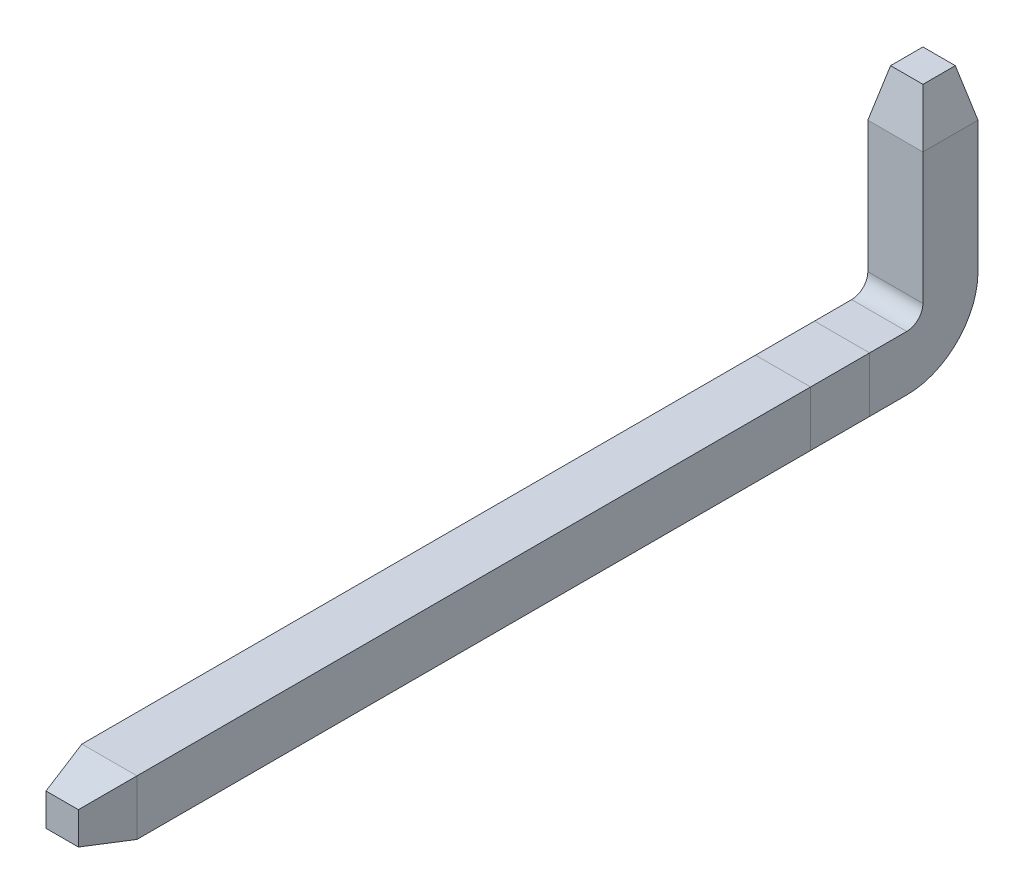
ISO-10303-21;
HEADER;
FILE_DESCRIPTION(('STEP AP214'),'2;1');
FILE_NAME('part.step','',(''),(''),'','','');
FILE_SCHEMA(('AUTOMOTIVE_DESIGN { 1 0 10303 214 1 1 1 1 }'));
ENDSEC;
DATA;
#1=APPLICATION_CONTEXT('core data for automotive mechanical design processes');
#2=APPLICATION_PROTOCOL_DEFINITION('international standard','automotive_design',2000,#1);
#3=PRODUCT_CONTEXT('',#1,'mechanical');
#4=PRODUCT('Part','Part','',(#3));
#5=PRODUCT_RELATED_PRODUCT_CATEGORY('part','',(#4));
#6=PRODUCT_DEFINITION_FORMATION('','',#4);
#7=PRODUCT_DEFINITION_CONTEXT('part definition',#1,'design');
#8=PRODUCT_DEFINITION('design','',#6,#7);
#9=PRODUCT_DEFINITION_SHAPE('','',#8);
#10=(LENGTH_UNIT() NAMED_UNIT(*) SI_UNIT(.MILLI.,.METRE.));
#11=(NAMED_UNIT(*) PLANE_ANGLE_UNIT() SI_UNIT($,.RADIAN.));
#12=(NAMED_UNIT(*) SI_UNIT($,.STERADIAN.) SOLID_ANGLE_UNIT());
#13=UNCERTAINTY_MEASURE_WITH_UNIT(LENGTH_MEASURE(1.E-05),#10,'distance_accuracy_value','');
#14=(GEOMETRIC_REPRESENTATION_CONTEXT(3) GLOBAL_UNCERTAINTY_ASSIGNED_CONTEXT((#13)) GLOBAL_UNIT_ASSIGNED_CONTEXT((#10,
#11,#12)) REPRESENTATION_CONTEXT('',''));
#15=CARTESIAN_POINT('',(0.,0.,0.));
#16=DIRECTION('',(0.,0.,1.));
#17=DIRECTION('',(1.,0.,0.));
#18=AXIS2_PLACEMENT_3D('',#15,#16,#17);
#19=CARTESIAN_POINT('',(8.598,-0.315,0.705));
#20=DIRECTION('',(0.,-1.,0.));
#21=DIRECTION('',(0.,0.,-1.));
#22=AXIS2_PLACEMENT_3D('',#19,#20,#21);
#23=PLANE('',#22);
#24=DIRECTION('',(0.,0.,-1.));
#25=VECTOR('',#24,1.);
#26=CARTESIAN_POINT('',(7.305,-0.315,0.705));
#27=LINE('',#26,#25);
#28=CARTESIAN_POINT('',(7.305,-0.315,1.915));
#29=VERTEX_POINT('',#28);
#30=CARTESIAN_POINT('',(7.305,-0.315,1.24005256704126));
#31=VERTEX_POINT('',#30);
#32=EDGE_CURVE('E11',#29,#31,#27,.T.);
#33=ORIENTED_EDGE('',*,*,#32,.T.);
#34=DIRECTION('',(1.,0.,0.));
#35=VECTOR('',#34,1.);
#36=CARTESIAN_POINT('',(8.598,-0.315,1.24005256704126));
#37=LINE('',#36,#35);
#38=CARTESIAN_POINT('',(7.935,-0.315,1.24005256704126));
#39=VERTEX_POINT('',#38);
#40=EDGE_CURVE('E25',#31,#39,#37,.T.);
#41=ORIENTED_EDGE('',*,*,#40,.T.);
#42=DIRECTION('',(0.,0.,1.));
#43=VECTOR('',#42,1.);
#44=CARTESIAN_POINT('',(7.935,-0.315,0.705));
#45=LINE('',#44,#43);
#46=CARTESIAN_POINT('',(7.935,-0.315,1.915));
#47=VERTEX_POINT('',#46);
#48=EDGE_CURVE('E374',#39,#47,#45,.T.);
#49=ORIENTED_EDGE('',*,*,#48,.T.);
#50=DIRECTION('',(1.,0.,0.));
#51=VECTOR('',#50,1.);
#52=CARTESIAN_POINT('',(8.598,-0.315,1.915));
#53=LINE('',#52,#51);
#54=EDGE_CURVE('E370',#29,#47,#53,.T.);
#55=ORIENTED_EDGE('',*,*,#54,.F.);
#56=EDGE_LOOP('',(#33,#41,#49,#55));
#57=FACE_BOUND('',#56,.T.);
#58=ADVANCED_FACE('F17',(#57),#23,.T.);
#59=CARTESIAN_POINT('',(8.598,0.315,2.025));
#60=DIRECTION('',(0.,1.,0.));
#61=DIRECTION('',(1.,0.,0.));
#62=AXIS2_PLACEMENT_3D('',#59,#60,#61);
#63=PLANE('',#62);
#64=DIRECTION('',(0.,0.,1.));
#65=VECTOR('',#64,1.);
#66=CARTESIAN_POINT('',(7.935,0.315,-0.1915));
#67=LINE('',#66,#65);
#68=CARTESIAN_POINT('',(7.935,0.315,1.24005256704126));
#69=VERTEX_POINT('',#68);
#70=CARTESIAN_POINT('',(7.935,0.315,1.915));
#71=VERTEX_POINT('',#70);
#72=EDGE_CURVE('E367',#69,#71,#67,.T.);
#73=ORIENTED_EDGE('',*,*,#72,.F.);
#74=DIRECTION('',(-1.,0.,0.));
#75=VECTOR('',#74,1.);
#76=CARTESIAN_POINT('',(8.598,0.315,1.24005256704126));
#77=LINE('',#76,#75);
#78=CARTESIAN_POINT('',(7.305,0.315,1.24005256704126));
#79=VERTEX_POINT('',#78);
#80=EDGE_CURVE('E365',#69,#79,#77,.T.);
#81=ORIENTED_EDGE('',*,*,#80,.T.);
#82=DIRECTION('',(0.,0.,-1.));
#83=VECTOR('',#82,1.);
#84=CARTESIAN_POINT('',(7.305,0.315,-0.1915));
#85=LINE('',#84,#83);
#86=CARTESIAN_POINT('',(7.305,0.315,1.915));
#87=VERTEX_POINT('',#86);
#88=EDGE_CURVE('E361',#87,#79,#85,.T.);
#89=ORIENTED_EDGE('',*,*,#88,.F.);
#90=DIRECTION('',(-1.,0.,0.));
#91=VECTOR('',#90,1.);
#92=CARTESIAN_POINT('',(8.598,0.315,1.915));
#93=LINE('',#92,#91);
#94=EDGE_CURVE('E357',#71,#87,#93,.T.);
#95=ORIENTED_EDGE('',*,*,#94,.F.);
#96=EDGE_LOOP('',(#73,#81,#89,#95));
#97=FACE_BOUND('',#96,.T.);
#98=ADVANCED_FACE('F422',(#97),#63,.T.);
#99=CARTESIAN_POINT('',(7.305,2.8255,-0.1915));
#100=DIRECTION('',(-1.,0.,0.));
#101=DIRECTION('',(0.,0.,1.));
#102=AXIS2_PLACEMENT_3D('',#99,#100,#101);
#103=PLANE('',#102);
#104=ORIENTED_EDGE('',*,*,#88,.T.);
#105=DIRECTION('',(0.,-1.,0.));
#106=VECTOR('',#105,1.);
#107=CARTESIAN_POINT('',(7.305,2.8255,1.24005256704126));
#108=LINE('',#107,#106);
#109=EDGE_CURVE('E355',#79,#31,#108,.T.);
#110=ORIENTED_EDGE('',*,*,#109,.T.);
#111=ORIENTED_EDGE('',*,*,#32,.F.);
#112=DIRECTION('',(0.,-1.,0.));
#113=VECTOR('',#112,1.);
#114=CARTESIAN_POINT('',(7.305,0.978,1.915));
#115=LINE('',#114,#113);
#116=EDGE_CURVE('E351',#87,#29,#115,.T.);
#117=ORIENTED_EDGE('',*,*,#116,.F.);
#118=EDGE_LOOP('',(#104,#110,#111,#117));
#119=FACE_BOUND('',#118,.T.);
#120=ADVANCED_FACE('F424',(#119),#103,.T.);
#121=CARTESIAN_POINT('',(7.935,2.8255,-0.1915));
#122=DIRECTION('',(1.,0.,0.));
#123=DIRECTION('',(0.,1.,0.));
#124=AXIS2_PLACEMENT_3D('',#121,#122,#123);
#125=PLANE('',#124);
#126=ORIENTED_EDGE('',*,*,#48,.F.);
#127=DIRECTION('',(0.,1.,0.));
#128=VECTOR('',#127,1.);
#129=CARTESIAN_POINT('',(7.935,2.8255,1.24005256704126));
#130=LINE('',#129,#128);
#131=EDGE_CURVE('E348',#39,#69,#130,.T.);
#132=ORIENTED_EDGE('',*,*,#131,.T.);
#133=ORIENTED_EDGE('',*,*,#72,.T.);
#134=DIRECTION('',(0.,1.,0.));
#135=VECTOR('',#134,1.);
#136=CARTESIAN_POINT('',(7.935,0.978,1.915));
#137=LINE('',#136,#135);
#138=EDGE_CURVE('E344',#47,#71,#137,.T.);
#139=ORIENTED_EDGE('',*,*,#138,.F.);
#140=EDGE_LOOP('',(#126,#132,#133,#139));
#141=FACE_BOUND('',#140,.T.);
#142=ADVANCED_FACE('F381',(#141),#125,.T.);
#143=CARTESIAN_POINT('',(8.598,2.54,1.293));
#144=DIRECTION('',(0.,1.,0.));
#145=DIRECTION('',(1.,0.,0.));
#146=AXIS2_PLACEMENT_3D('',#143,#144,#145);
#147=PLANE('',#146);
#148=DIRECTION('',(9.0573847817001E-05,0.,-0.999999995898189));
#149=VECTOR('',#148,1.);
#150=CARTESIAN_POINT('',(7.43487635788854,2.54,-0.000222915201498932));
#151=LINE('',#150,#149);
#152=CARTESIAN_POINT('',(7.4348495218709,2.54001212571568,0.499678242049048));
#153=VERTEX_POINT('',#152);
#154=CARTESIAN_POINT('',(7.43486461504236,2.54,0.12942649701042));
#155=VERTEX_POINT('',#154);
#156=EDGE_CURVE('E339',#153,#155,#151,.T.);
#157=ORIENTED_EDGE('',*,*,#156,.F.);
#158=DIRECTION('',(-1.,0.,0.));
#159=VECTOR('',#158,1.);
#160=CARTESIAN_POINT('',(7.30500000015227,2.54,0.499730833388735));
#161=LINE('',#160,#159);
#162=CARTESIAN_POINT('',(7.80515047843365,2.54001212571568,0.499678242049049));
#163=VERTEX_POINT('',#162);
#164=EDGE_CURVE('E333',#163,#153,#161,.T.);
#165=ORIENTED_EDGE('',*,*,#164,.F.);
#166=DIRECTION('',(9.05738478169111E-05,0.,0.999999995898189));
#167=VECTOR('',#166,1.);
#168=CARTESIAN_POINT('',(7.80518070393584,2.54,0.629777034937407));
#169=LINE('',#168,#167);
#170=CARTESIAN_POINT('',(7.80513538526218,2.54,0.12942649701042));
#171=VERTEX_POINT('',#170);
#172=EDGE_CURVE('E327',#171,#163,#169,.T.);
#173=ORIENTED_EDGE('',*,*,#172,.F.);
#174=DIRECTION('',(1.,0.,0.));
#175=VECTOR('',#174,1.);
#176=CARTESIAN_POINT('',(7.93500000015227,2.54,0.12942649701042));
#177=LINE('',#176,#175);
#178=EDGE_CURVE('E323',#155,#171,#177,.T.);
#179=ORIENTED_EDGE('',*,*,#178,.F.);
#180=EDGE_LOOP('',(#157,#165,#173,#179));
#181=FACE_BOUND('',#180,.T.);
#182=ADVANCED_FACE('F458',(#181),#147,.T.);
#183=CARTESIAN_POINT('',(7.30500000015227,2.00011653491076,0.629765276704178));
#184=DIRECTION('',(0.,0.234160215533744,0.972198021732811));
#185=DIRECTION('',(1.,0.,0.));
#186=AXIS2_PLACEMENT_3D('',#183,#184,#185);
#187=PLANE('',#186);
#188=DIRECTION('',(0.227655002210228,-0.946669905004514,0.228011602615756));
#189=VECTOR('',#188,1.);
#190=CARTESIAN_POINT('',(7.93500000015227,2.00011653491076,0.629765276704179));
#191=LINE('',#190,#189);
#192=CARTESIAN_POINT('',(7.93500000028708,2.00010401844251,0.629886441826773));
#193=VERTEX_POINT('',#192);
#194=EDGE_CURVE('E318',#163,#193,#191,.T.);
#195=ORIENTED_EDGE('',*,*,#194,.F.);
#196=ORIENTED_EDGE('',*,*,#164,.T.);
#197=DIRECTION('',(0.227655002210228,0.946669905004514,-0.228011602615756));
#198=VECTOR('',#197,1.);
#199=CARTESIAN_POINT('',(7.33765088417201,2.13589044267994,0.597063248108785));
#200=LINE('',#199,#198);
#201=CARTESIAN_POINT('',(7.304999999793,2.00010401843991,0.629886441828584));
#202=VERTEX_POINT('',#201);
#203=EDGE_CURVE('E312',#202,#153,#200,.T.);
#204=ORIENTED_EDGE('',*,*,#203,.F.);
#205=DIRECTION('',(-1.,0.,0.));
#206=VECTOR('',#205,1.);
#207=CARTESIAN_POINT('',(8.598,1.9991419990643,0.63));
#208=LINE('',#207,#206);
#209=EDGE_CURVE('E306',#193,#202,#208,.T.);
#210=ORIENTED_EDGE('',*,*,#209,.F.);
#211=EDGE_LOOP('',(#195,#196,#204,#210));
#212=FACE_BOUND('',#211,.T.);
#213=ADVANCED_FACE('F404',(#212),#187,.T.);
#214=CARTESIAN_POINT('',(7.30500000015227,1.99987923142851,-0.000234678603007815));
#215=DIRECTION('',(-0.972286154406282,0.233793982374715,-8.80636985449924E-05));
#216=DIRECTION('',(-9.05738478170011E-05,0.,0.999999995898189));
#217=AXIS2_PLACEMENT_3D('',#214,#215,#216);
#218=PLANE('',#217);
#219=ORIENTED_EDGE('',*,*,#203,.T.);
#220=ORIENTED_EDGE('',*,*,#156,.T.);
#221=DIRECTION('',(0.227655002210228,0.946841407622854,0.227298369504565));
#222=VECTOR('',#221,1.);
#223=CARTESIAN_POINT('',(7.33765088417201,2.13567773655794,0.0323650562085161));
#224=LINE('',#223,#222);
#225=CARTESIAN_POINT('',(7.30499999979406,1.99989171173503,-0.000113559496830448));
#226=VERTEX_POINT('',#225);
#227=EDGE_CURVE('E300',#226,#155,#224,.T.);
#228=ORIENTED_EDGE('',*,*,#227,.F.);
#229=DIRECTION('',(0.,-0.000376672180686717,-0.999999929059032));
#230=VECTOR('',#229,1.);
#231=CARTESIAN_POINT('',(7.305,2.00011653491076,0.629882638352091));
#232=LINE('',#231,#230);
#233=EDGE_CURVE('E294',#202,#226,#232,.T.);
#234=ORIENTED_EDGE('',*,*,#233,.F.);
#235=EDGE_LOOP('',(#219,#220,#228,#234));
#236=FACE_BOUND('',#235,.T.);
#237=ADVANCED_FACE('F410',(#236),#218,.T.);
#238=CARTESIAN_POINT('',(7.93500000015227,1.99987923142851,-0.000234678603007951));
#239=DIRECTION('',(0.,0.233427749215686,-0.972374149129901));
#240=DIRECTION('',(-1.,0.,0.));
#241=AXIS2_PLACEMENT_3D('',#238,#239,#240);
#242=PLANE('',#241);
#243=ORIENTED_EDGE('',*,*,#227,.T.);
#244=ORIENTED_EDGE('',*,*,#178,.T.);
#245=DIRECTION('',(-0.227655002210228,0.946841407622854,0.227298369504565));
#246=VECTOR('',#245,1.);
#247=CARTESIAN_POINT('',(7.90234911613253,2.13567773655793,0.0323650562085151));
#248=LINE('',#247,#246);
#249=CARTESIAN_POINT('',(7.93500000028601,1.99989171173759,-0.000113559495025209));
#250=VERTEX_POINT('',#249);
#251=EDGE_CURVE('E288',#250,#171,#248,.T.);
#252=ORIENTED_EDGE('',*,*,#251,.F.);
#253=DIRECTION('',(1.,0.,0.));
#254=VECTOR('',#253,1.);
#255=CARTESIAN_POINT('',(8.598,2.00085681617448,0.));
#256=LINE('',#255,#254);
#257=EDGE_CURVE('E282',#226,#250,#256,.T.);
#258=ORIENTED_EDGE('',*,*,#257,.F.);
#259=EDGE_LOOP('',(#243,#244,#252,#258));
#260=FACE_BOUND('',#259,.T.);
#261=ADVANCED_FACE('F466',(#260),#242,.T.);
#262=CARTESIAN_POINT('',(7.93500000015227,2.00011653491076,0.629765276704179));
#263=DIRECTION('',(0.972286154406282,0.233793982374715,-8.8063698544905E-05));
#264=DIRECTION('',(0.,-0.000376672194053463,-0.999999929059027));
#265=AXIS2_PLACEMENT_3D('',#262,#263,#264);
#266=PLANE('',#265);
#267=ORIENTED_EDGE('',*,*,#251,.T.);
#268=ORIENTED_EDGE('',*,*,#172,.T.);
#269=ORIENTED_EDGE('',*,*,#194,.T.);
#270=DIRECTION('',(0.,0.000376672180686717,0.999999929059032));
#271=VECTOR('',#270,1.);
#272=CARTESIAN_POINT('',(7.935,1.99987923142851,-0.00011733930150299));
#273=LINE('',#272,#271);
#274=EDGE_CURVE('E276',#250,#193,#273,.T.);
#275=ORIENTED_EDGE('',*,*,#274,.F.);
#276=EDGE_LOOP('',(#267,#268,#269,#275));
#277=FACE_BOUND('',#276,.T.);
#278=ADVANCED_FACE('F400',(#277),#266,.T.);
#279=CARTESIAN_POINT('',(8.598,0.296,0.63));
#280=DIRECTION('',(0.,0.,1.));
#281=DIRECTION('',(1.,0.,0.));
#282=AXIS2_PLACEMENT_3D('',#279,#280,#281);
#283=PLANE('',#282);
#284=DIRECTION('',(0.,-1.,0.));
#285=VECTOR('',#284,1.);
#286=CARTESIAN_POINT('',(7.935,2.8255,0.63));
#287=LINE('',#286,#285);
#288=CARTESIAN_POINT('',(7.935,0.5,0.63));
#289=VERTEX_POINT('',#288);
#290=EDGE_CURVE('E271',#193,#289,#287,.T.);
#291=ORIENTED_EDGE('',*,*,#290,.F.);
#292=ORIENTED_EDGE('',*,*,#209,.T.);
#293=DIRECTION('',(0.,1.,0.));
#294=VECTOR('',#293,1.);
#295=CARTESIAN_POINT('',(7.305,2.8255,0.63));
#296=LINE('',#295,#294);
#297=CARTESIAN_POINT('',(7.305,0.500000000000011,0.63));
#298=VERTEX_POINT('',#297);
#299=EDGE_CURVE('E265',#298,#202,#296,.T.);
#300=ORIENTED_EDGE('',*,*,#299,.F.);
#301=DIRECTION('',(-1.,0.,0.));
#302=VECTOR('',#301,1.);
#303=CARTESIAN_POINT('',(7.998,0.5,0.63));
#304=LINE('',#303,#302);
#305=EDGE_CURVE('E261',#289,#298,#304,.T.);
#306=ORIENTED_EDGE('',*,*,#305,.F.);
#307=EDGE_LOOP('',(#291,#292,#300,#306));
#308=FACE_BOUND('',#307,.T.);
#309=ADVANCED_FACE('F407',(#308),#283,.T.);
#310=CARTESIAN_POINT('',(7.998,0.5,0.815));
#311=DIRECTION('',(-1.,0.,0.));
#312=DIRECTION('',(0.,0.,1.));
#313=AXIS2_PLACEMENT_3D('',#310,#311,#312);
#314=CYLINDRICAL_SURFACE('',#313,0.185);
#315=ORIENTED_EDGE('',*,*,#305,.T.);
#316=CARTESIAN_POINT('',(7.305,0.500000000000012,0.815000000000011));
#317=DIRECTION('',(1.,0.,0.));
#318=DIRECTION('',(0.,0.,1.));
#319=AXIS2_PLACEMENT_3D('',#316,#317,#318);
#320=CIRCLE('',#319,0.185);
#321=CARTESIAN_POINT('',(7.305,0.315,0.815));
#322=VERTEX_POINT('',#321);
#323=EDGE_CURVE('E257',#322,#298,#320,.T.);
#324=ORIENTED_EDGE('',*,*,#323,.F.);
#325=DIRECTION('',(-1.,0.,0.));
#326=VECTOR('',#325,1.);
#327=CARTESIAN_POINT('',(8.598,0.315,0.815));
#328=LINE('',#327,#326);
#329=CARTESIAN_POINT('',(7.935,0.315,0.815));
#330=VERTEX_POINT('',#329);
#331=EDGE_CURVE('E253',#330,#322,#328,.T.);
#332=ORIENTED_EDGE('',*,*,#331,.F.);
#333=CARTESIAN_POINT('',(7.935,0.5,0.815));
#334=DIRECTION('',(-1.,0.,0.));
#335=DIRECTION('',(0.,0.,1.));
#336=AXIS2_PLACEMENT_3D('',#333,#334,#335);
#337=CIRCLE('',#336,0.185);
#338=EDGE_CURVE('E249',#289,#330,#337,.T.);
#339=ORIENTED_EDGE('',*,*,#338,.F.);
#340=EDGE_LOOP('',(#315,#324,#332,#339));
#341=FACE_BOUND('',#340,.T.);
#342=ADVANCED_FACE('F416',(#341),#314,.F.);
#343=CARTESIAN_POINT('',(8.598,0.315,2.025));
#344=DIRECTION('',(0.,1.,0.));
#345=DIRECTION('',(1.,0.,0.));
#346=AXIS2_PLACEMENT_3D('',#343,#344,#345);
#347=PLANE('',#346);
#348=ORIENTED_EDGE('',*,*,#80,.F.);
#349=DIRECTION('',(0.,0.,1.));
#350=VECTOR('',#349,1.);
#351=CARTESIAN_POINT('',(7.935,0.315,-0.1915));
#352=LINE('',#351,#350);
#353=EDGE_CURVE('E245',#330,#69,#352,.T.);
#354=ORIENTED_EDGE('',*,*,#353,.F.);
#355=ORIENTED_EDGE('',*,*,#331,.T.);
#356=DIRECTION('',(0.,0.,-1.));
#357=VECTOR('',#356,1.);
#358=CARTESIAN_POINT('',(7.305,0.315,-0.1915));
#359=LINE('',#358,#357);
#360=EDGE_CURVE('E241',#79,#322,#359,.T.);
#361=ORIENTED_EDGE('',*,*,#360,.F.);
#362=EDGE_LOOP('',(#348,#354,#355,#361));
#363=FACE_BOUND('',#362,.T.);
#364=ADVANCED_FACE('F420',(#363),#347,.T.);
#365=CARTESIAN_POINT('',(7.305,2.8255,-0.1915));
#366=DIRECTION('',(-1.,0.,0.));
#367=DIRECTION('',(0.,0.,1.));
#368=AXIS2_PLACEMENT_3D('',#365,#366,#367);
#369=PLANE('',#368);
#370=ORIENTED_EDGE('',*,*,#109,.F.);
#371=ORIENTED_EDGE('',*,*,#360,.T.);
#372=ORIENTED_EDGE('',*,*,#323,.T.);
#373=ORIENTED_EDGE('',*,*,#299,.T.);
#374=ORIENTED_EDGE('',*,*,#233,.T.);
#375=DIRECTION('',(0.,1.,0.));
#376=VECTOR('',#375,1.);
#377=CARTESIAN_POINT('',(7.305,2.744,0.));
#378=LINE('',#377,#376);
#379=CARTESIAN_POINT('',(7.305,0.5,0.));
#380=VERTEX_POINT('',#379);
#381=EDGE_CURVE('E235',#380,#226,#378,.T.);
#382=ORIENTED_EDGE('',*,*,#381,.F.);
#383=CARTESIAN_POINT('',(7.305,0.5,0.815));
#384=DIRECTION('',(1.,0.,0.));
#385=DIRECTION('',(0.,0.,1.));
#386=AXIS2_PLACEMENT_3D('',#383,#384,#385);
#387=CIRCLE('',#386,0.815);
#388=CARTESIAN_POINT('',(7.305,-0.315,0.815));
#389=VERTEX_POINT('',#388);
#390=EDGE_CURVE('E231',#389,#380,#387,.T.);
#391=ORIENTED_EDGE('',*,*,#390,.F.);
#392=DIRECTION('',(0.,0.,-1.));
#393=VECTOR('',#392,1.);
#394=CARTESIAN_POINT('',(7.305,-0.315,0.705));
#395=LINE('',#394,#393);
#396=EDGE_CURVE('E227',#31,#389,#395,.T.);
#397=ORIENTED_EDGE('',*,*,#396,.F.);
#398=EDGE_LOOP('',(#370,#371,#372,#373,#374,#382,#391,#397));
#399=FACE_BOUND('',#398,.T.);
#400=ADVANCED_FACE('F413',(#399),#369,.T.);
#401=CARTESIAN_POINT('',(8.598,2.744,0.));
#402=DIRECTION('',(0.,0.,-1.));
#403=DIRECTION('',(0.,-1.,0.));
#404=AXIS2_PLACEMENT_3D('',#401,#402,#403);
#405=PLANE('',#404);
#406=ORIENTED_EDGE('',*,*,#381,.T.);
#407=ORIENTED_EDGE('',*,*,#257,.T.);
#408=DIRECTION('',(0.,1.,0.));
#409=VECTOR('',#408,1.);
#410=CARTESIAN_POINT('',(7.935,2.8255,0.));
#411=LINE('',#410,#409);
#412=CARTESIAN_POINT('',(7.935,0.5,0.));
#413=VERTEX_POINT('',#412);
#414=EDGE_CURVE('E221',#413,#250,#411,.T.);
#415=ORIENTED_EDGE('',*,*,#414,.F.);
#416=DIRECTION('',(1.,0.,0.));
#417=VECTOR('',#416,1.);
#418=CARTESIAN_POINT('',(7.998,0.5,0.));
#419=LINE('',#418,#417);
#420=EDGE_CURVE('E217',#380,#413,#419,.T.);
#421=ORIENTED_EDGE('',*,*,#420,.F.);
#422=EDGE_LOOP('',(#406,#407,#415,#421));
#423=FACE_BOUND('',#422,.T.);
#424=ADVANCED_FACE('F396',(#423),#405,.T.);
#425=CARTESIAN_POINT('',(7.935,2.8255,-0.1915));
#426=DIRECTION('',(1.,0.,0.));
#427=DIRECTION('',(0.,1.,0.));
#428=AXIS2_PLACEMENT_3D('',#425,#426,#427);
#429=PLANE('',#428);
#430=ORIENTED_EDGE('',*,*,#131,.F.);
#431=DIRECTION('',(0.,0.,1.));
#432=VECTOR('',#431,1.);
#433=CARTESIAN_POINT('',(7.935,-0.315,0.705));
#434=LINE('',#433,#432);
#435=CARTESIAN_POINT('',(7.935,-0.315,0.815));
#436=VERTEX_POINT('',#435);
#437=EDGE_CURVE('E213',#436,#39,#434,.T.);
#438=ORIENTED_EDGE('',*,*,#437,.F.);
#439=CARTESIAN_POINT('',(7.935,0.5,0.815));
#440=DIRECTION('',(-1.,0.,0.));
#441=DIRECTION('',(0.,0.,1.));
#442=AXIS2_PLACEMENT_3D('',#439,#440,#441);
#443=CIRCLE('',#442,0.815);
#444=EDGE_CURVE('E209',#413,#436,#443,.T.);
#445=ORIENTED_EDGE('',*,*,#444,.F.);
#446=ORIENTED_EDGE('',*,*,#414,.T.);
#447=ORIENTED_EDGE('',*,*,#274,.T.);
#448=ORIENTED_EDGE('',*,*,#290,.T.);
#449=ORIENTED_EDGE('',*,*,#338,.T.);
#450=ORIENTED_EDGE('',*,*,#353,.T.);
#451=EDGE_LOOP('',(#430,#438,#445,#446,#447,#448,#449,#450));
#452=FACE_BOUND('',#451,.T.);
#453=ADVANCED_FACE('F384',(#452),#429,.T.);
#454=CARTESIAN_POINT('',(8.598,-0.315,0.705));
#455=DIRECTION('',(0.,-1.,0.));
#456=DIRECTION('',(0.,0.,-1.));
#457=AXIS2_PLACEMENT_3D('',#454,#455,#456);
#458=PLANE('',#457);
#459=ORIENTED_EDGE('',*,*,#40,.F.);
#460=ORIENTED_EDGE('',*,*,#396,.T.);
#461=DIRECTION('',(-1.,0.,0.));
#462=VECTOR('',#461,1.);
#463=CARTESIAN_POINT('',(7.998,-0.315,0.815));
#464=LINE('',#463,#462);
#465=EDGE_CURVE('E205',#436,#389,#464,.T.);
#466=ORIENTED_EDGE('',*,*,#465,.F.);
#467=ORIENTED_EDGE('',*,*,#437,.T.);
#468=EDGE_LOOP('',(#459,#460,#466,#467));
#469=FACE_BOUND('',#468,.T.);
#470=ADVANCED_FACE('F388',(#469),#458,.T.);
#471=CARTESIAN_POINT('',(7.998,0.5,0.815));
#472=DIRECTION('',(-1.,0.,0.));
#473=DIRECTION('',(0.,0.,1.));
#474=AXIS2_PLACEMENT_3D('',#471,#472,#473);
#475=CYLINDRICAL_SURFACE('',#474,0.815);
#476=ORIENTED_EDGE('',*,*,#444,.T.);
#477=ORIENTED_EDGE('',*,*,#465,.T.);
#478=ORIENTED_EDGE('',*,*,#390,.T.);
#479=ORIENTED_EDGE('',*,*,#420,.T.);
#480=EDGE_LOOP('',(#476,#477,#478,#479));
#481=FACE_BOUND('',#480,.T.);
#482=ADVANCED_FACE('F391',(#481),#475,.T.);
#483=CARTESIAN_POINT('',(7.935,0.978,1.085));
#484=DIRECTION('',(1.,0.,0.));
#485=DIRECTION('',(0.,1.,0.));
#486=AXIS2_PLACEMENT_3D('',#483,#484,#485);
#487=PLANE('',#486);
#488=ORIENTED_EDGE('',*,*,#138,.T.);
#489=DIRECTION('',(0.,0.,-1.));
#490=VECTOR('',#489,1.);
#491=CARTESIAN_POINT('',(7.935,0.315,11.045));
#492=LINE('',#491,#490);
#493=CARTESIAN_POINT('',(7.935,0.315,9.61951947145762));
#494=VERTEX_POINT('',#493);
#495=EDGE_CURVE('E201',#494,#71,#492,.T.);
#496=ORIENTED_EDGE('',*,*,#495,.F.);
#497=DIRECTION('',(0.,1.,0.));
#498=VECTOR('',#497,1.);
#499=CARTESIAN_POINT('',(7.935,-0.315,9.61951947145762));
#500=LINE('',#499,#498);
#501=CARTESIAN_POINT('',(7.935,-0.315,9.61951947145762));
#502=VERTEX_POINT('',#501);
#503=EDGE_CURVE('E197',#502,#494,#500,.T.);
#504=ORIENTED_EDGE('',*,*,#503,.F.);
#505=DIRECTION('',(0.,0.,1.));
#506=VECTOR('',#505,1.);
#507=CARTESIAN_POINT('',(7.935,-0.315,1.085));
#508=LINE('',#507,#506);
#509=EDGE_CURVE('E193',#47,#502,#508,.T.);
#510=ORIENTED_EDGE('',*,*,#509,.F.);
#511=EDGE_LOOP('',(#488,#496,#504,#510));
#512=FACE_BOUND('',#511,.T.);
#513=ADVANCED_FACE('F435',(#512),#487,.T.);
#514=CARTESIAN_POINT('',(8.598,0.315,11.045));
#515=DIRECTION('',(0.,1.,0.));
#516=DIRECTION('',(1.,0.,0.));
#517=AXIS2_PLACEMENT_3D('',#514,#515,#516);
#518=PLANE('',#517);
#519=DIRECTION('',(0.,0.,-1.));
#520=VECTOR('',#519,1.);
#521=CARTESIAN_POINT('',(7.305,0.315,1.085));
#522=LINE('',#521,#520);
#523=CARTESIAN_POINT('',(7.305,0.315,9.61951947145763));
#524=VERTEX_POINT('',#523);
#525=EDGE_CURVE('E189',#524,#87,#522,.T.);
#526=ORIENTED_EDGE('',*,*,#525,.F.);
#527=DIRECTION('',(-1.,0.,0.));
#528=VECTOR('',#527,1.);
#529=CARTESIAN_POINT('',(7.935,0.315,9.61951947145762));
#530=LINE('',#529,#528);
#531=EDGE_CURVE('E185',#494,#524,#530,.T.);
#532=ORIENTED_EDGE('',*,*,#531,.F.);
#533=ORIENTED_EDGE('',*,*,#495,.T.);
#534=ORIENTED_EDGE('',*,*,#94,.T.);
#535=EDGE_LOOP('',(#526,#532,#533,#534));
#536=FACE_BOUND('',#535,.T.);
#537=ADVANCED_FACE('F429',(#536),#518,.T.);
#538=CARTESIAN_POINT('',(7.305,0.978,1.085));
#539=DIRECTION('',(-1.,0.,0.));
#540=DIRECTION('',(0.,0.,1.));
#541=AXIS2_PLACEMENT_3D('',#538,#539,#540);
#542=PLANE('',#541);
#543=DIRECTION('',(0.,0.,-1.));
#544=VECTOR('',#543,1.);
#545=CARTESIAN_POINT('',(7.305,-0.315,1.085));
#546=LINE('',#545,#544);
#547=CARTESIAN_POINT('',(7.305,-0.315,9.61951947145762));
#548=VERTEX_POINT('',#547);
#549=EDGE_CURVE('E181',#548,#29,#546,.T.);
#550=ORIENTED_EDGE('',*,*,#549,.F.);
#551=DIRECTION('',(0.,-1.,0.));
#552=VECTOR('',#551,1.);
#553=CARTESIAN_POINT('',(7.305,0.315,9.61951947145762));
#554=LINE('',#553,#552);
#555=EDGE_CURVE('E134',#524,#548,#554,.T.);
#556=ORIENTED_EDGE('',*,*,#555,.F.);
#557=ORIENTED_EDGE('',*,*,#525,.T.);
#558=ORIENTED_EDGE('',*,*,#116,.T.);
#559=EDGE_LOOP('',(#550,#556,#557,#558));
#560=FACE_BOUND('',#559,.T.);
#561=ADVANCED_FACE('F426',(#560),#542,.T.);
#562=CARTESIAN_POINT('',(8.598,-0.315,1.085));
#563=DIRECTION('',(0.,-1.,0.));
#564=DIRECTION('',(0.,0.,-1.));
#565=AXIS2_PLACEMENT_3D('',#562,#563,#564);
#566=PLANE('',#565);
#567=ORIENTED_EDGE('',*,*,#509,.T.);
#568=DIRECTION('',(1.,0.,0.));
#569=VECTOR('',#568,1.);
#570=CARTESIAN_POINT('',(7.305,-0.315,9.61951947145762));
#571=LINE('',#570,#569);
#572=EDGE_CURVE('E176',#548,#502,#571,.T.);
#573=ORIENTED_EDGE('',*,*,#572,.F.);
#574=ORIENTED_EDGE('',*,*,#549,.T.);
#575=ORIENTED_EDGE('',*,*,#54,.T.);
#576=EDGE_LOOP('',(#567,#573,#574,#575));
#577=FACE_BOUND('',#576,.T.);
#578=ADVANCED_FACE('F437',(#577),#566,.T.);
#579=CARTESIAN_POINT('',(7.935,-0.315,9.61951947145762));
#580=DIRECTION('',(0.972286154406282,0.,0.233793998960289));
#581=DIRECTION('',(0.,-1.,0.));
#582=AXIS2_PLACEMENT_3D('',#579,#580,#581);
#583=PLANE('',#582);
#584=DIRECTION('',(0.227655002210227,0.227655002210228,-0.946755723477457));
#585=VECTOR('',#584,1.);
#586=CARTESIAN_POINT('',(7.80515267175573,0.18515267175573,10.1595194714576));
#587=LINE('',#586,#585);
#588=CARTESIAN_POINT('',(7.80515267175573,0.185152671755728,10.1595194714576));
#589=VERTEX_POINT('',#588);
#590=EDGE_CURVE('E172',#589,#494,#587,.T.);
#591=ORIENTED_EDGE('',*,*,#590,.F.);
#592=DIRECTION('',(0.,1.,0.));
#593=VECTOR('',#592,1.);
#594=CARTESIAN_POINT('',(7.80515267175573,-0.185,10.1595194714576));
#595=LINE('',#594,#593);
#596=CARTESIAN_POINT('',(7.80515267175573,-0.18515267175573,10.1595194714576));
#597=VERTEX_POINT('',#596);
#598=EDGE_CURVE('E169',#597,#589,#595,.T.);
#599=ORIENTED_EDGE('',*,*,#598,.F.);
#600=DIRECTION('',(-0.227655002210219,0.227655002210228,0.946755723477459));
#601=VECTOR('',#600,1.);
#602=CARTESIAN_POINT('',(7.935,-0.315,9.61951947145762));
#603=LINE('',#602,#601);
#604=EDGE_CURVE('E154',#502,#597,#603,.T.);
#605=ORIENTED_EDGE('',*,*,#604,.F.);
#606=ORIENTED_EDGE('',*,*,#503,.T.);
#607=EDGE_LOOP('',(#591,#599,#605,#606));
#608=FACE_BOUND('',#607,.T.);
#609=ADVANCED_FACE('F433',(#608),#583,.T.);
#610=CARTESIAN_POINT('',(7.935,0.315,9.61951947145762));
#611=DIRECTION('',(0.,0.972286154406282,0.233793998960289));
#612=DIRECTION('',(1.,0.,0.));
#613=AXIS2_PLACEMENT_3D('',#610,#611,#612);
#614=PLANE('',#613);
#615=DIRECTION('',(-0.227655002210228,0.227655002210236,-0.946755723477455));
#616=VECTOR('',#615,1.);
#617=CARTESIAN_POINT('',(7.43484732824427,0.185152671755725,10.1595194714576));
#618=LINE('',#617,#616);
#619=CARTESIAN_POINT('',(7.43484732824427,0.185152671755725,10.1595194714576));
#620=VERTEX_POINT('',#619);
#621=EDGE_CURVE('E164',#620,#524,#618,.T.);
#622=ORIENTED_EDGE('',*,*,#621,.F.);
#623=DIRECTION('',(-1.,0.,0.));
#624=VECTOR('',#623,1.);
#625=CARTESIAN_POINT('',(7.236,0.185152671755725,10.1595194714576));
#626=LINE('',#625,#624);
#627=EDGE_CURVE('E140',#589,#620,#626,.T.);
#628=ORIENTED_EDGE('',*,*,#627,.F.);
#629=ORIENTED_EDGE('',*,*,#590,.T.);
#630=ORIENTED_EDGE('',*,*,#531,.T.);
#631=EDGE_LOOP('',(#622,#628,#629,#630));
#632=FACE_BOUND('',#631,.T.);
#633=ADVANCED_FACE('F431',(#632),#614,.T.);
#634=CARTESIAN_POINT('',(7.305,0.315,9.61951947145762));
#635=DIRECTION('',(-0.972286154406282,0.,0.233793998960289));
#636=DIRECTION('',(0.,1.,0.));
#637=AXIS2_PLACEMENT_3D('',#634,#635,#636);
#638=PLANE('',#637);
#639=DIRECTION('',(-0.227655002210219,-0.227655002210228,-0.946755723477459));
#640=VECTOR('',#639,1.);
#641=CARTESIAN_POINT('',(7.43485567322656,-0.185144326773435,10.1595541759871));
#642=LINE('',#641,#640);
#643=CARTESIAN_POINT('',(7.43484732824427,-0.18515267175573,10.1595194714576));
#644=VERTEX_POINT('',#643);
#645=EDGE_CURVE('E128',#644,#548,#642,.T.);
#646=ORIENTED_EDGE('',*,*,#645,.F.);
#647=DIRECTION('',(0.,-1.,0.));
#648=VECTOR('',#647,1.);
#649=CARTESIAN_POINT('',(7.43484732824427,-0.185,10.1595194714576));
#650=LINE('',#649,#648);
#651=EDGE_CURVE('E132',#620,#644,#650,.T.);
#652=ORIENTED_EDGE('',*,*,#651,.F.);
#653=ORIENTED_EDGE('',*,*,#621,.T.);
#654=ORIENTED_EDGE('',*,*,#555,.T.);
#655=EDGE_LOOP('',(#646,#652,#653,#654));
#656=FACE_BOUND('',#655,.T.);
#657=ADVANCED_FACE('F130',(#656),#638,.T.);
#658=CARTESIAN_POINT('',(7.305,-0.315,9.61951947145762));
#659=DIRECTION('',(0.,-0.972286154406282,0.233793998960289));
#660=DIRECTION('',(-1.,0.,0.));
#661=AXIS2_PLACEMENT_3D('',#658,#659,#660);
#662=PLANE('',#661);
#663=ORIENTED_EDGE('',*,*,#604,.T.);
#664=DIRECTION('',(1.,0.,0.));
#665=VECTOR('',#664,1.);
#666=CARTESIAN_POINT('',(7.236,-0.18515267175573,10.1595194714576));
#667=LINE('',#666,#665);
#668=EDGE_CURVE('E147',#644,#597,#667,.T.);
#669=ORIENTED_EDGE('',*,*,#668,.F.);
#670=ORIENTED_EDGE('',*,*,#645,.T.);
#671=ORIENTED_EDGE('',*,*,#572,.T.);
#672=EDGE_LOOP('',(#663,#669,#670,#671));
#673=FACE_BOUND('',#672,.T.);
#674=ADVANCED_FACE('F152',(#673),#662,.T.);
#675=CARTESIAN_POINT('',(7.236,-0.185,10.1595194714576));
#676=DIRECTION('',(0.,0.,1.));
#677=DIRECTION('',(1.,0.,0.));
#678=AXIS2_PLACEMENT_3D('',#675,#676,#677);
#679=PLANE('',#678);
#680=ORIENTED_EDGE('',*,*,#651,.T.);
#681=ORIENTED_EDGE('',*,*,#668,.T.);
#682=ORIENTED_EDGE('',*,*,#598,.T.);
#683=ORIENTED_EDGE('',*,*,#627,.T.);
#684=EDGE_LOOP('',(#680,#681,#682,#683));
#685=FACE_BOUND('',#684,.T.);
#686=ADVANCED_FACE('F145',(#685),#679,.T.);
#687=CLOSED_SHELL('',(#58,#98,#120,#142,#182,#213,#237,#261,#278,#309,#342,#364,#400,#424,#453,
#470,#482,#513,#537,#561,#578,#609,#633,#657,#674,#686));
#688=MANIFOLD_SOLID_BREP('B1',#687);
#689=ADVANCED_BREP_SHAPE_REPRESENTATION('',(#18,#688),#14);
#690=SHAPE_DEFINITION_REPRESENTATION(#9,#689);
ENDSEC;
END-ISO-10303-21;
